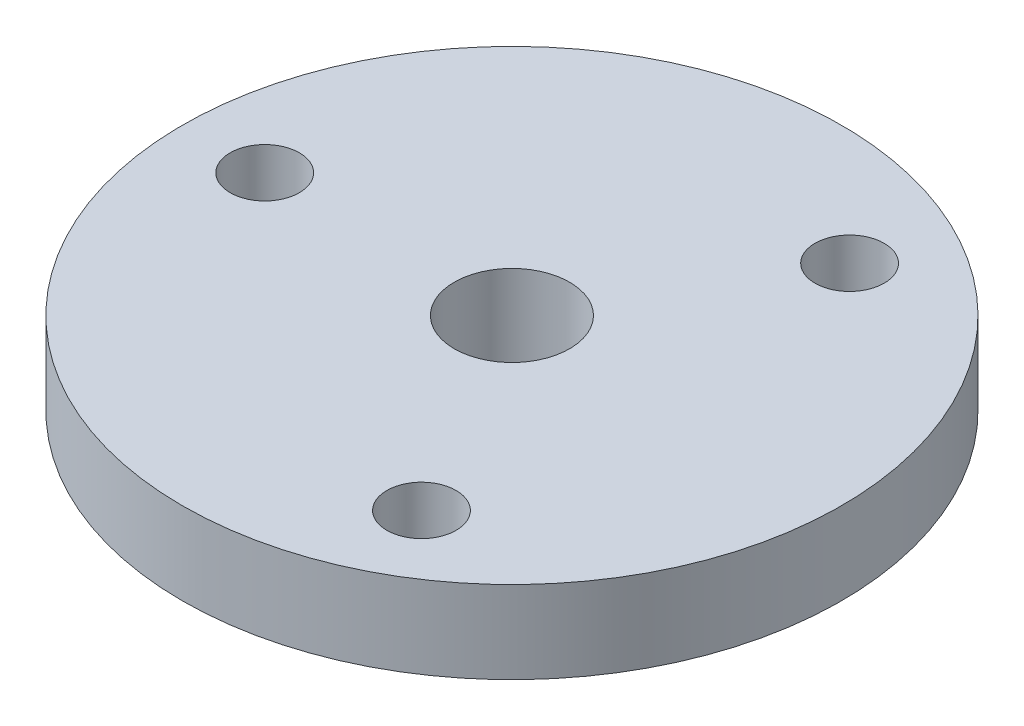
ISO-10303-21;
HEADER;
FILE_DESCRIPTION(('STEP AP214'),'2;1');
FILE_NAME('part.step','',(''),(''),'','','');
FILE_SCHEMA(('AUTOMOTIVE_DESIGN { 1 0 10303 214 1 1 1 1 }'));
ENDSEC;
DATA;
#1=APPLICATION_CONTEXT('core data for automotive mechanical design processes');
#2=APPLICATION_PROTOCOL_DEFINITION('international standard','automotive_design',2000,#1);
#3=PRODUCT_CONTEXT('',#1,'mechanical');
#4=PRODUCT('Part','Part','',(#3));
#5=PRODUCT_RELATED_PRODUCT_CATEGORY('part','',(#4));
#6=PRODUCT_DEFINITION_FORMATION('','',#4);
#7=PRODUCT_DEFINITION_CONTEXT('part definition',#1,'design');
#8=PRODUCT_DEFINITION('design','',#6,#7);
#9=PRODUCT_DEFINITION_SHAPE('','',#8);
#10=(LENGTH_UNIT() NAMED_UNIT(*) SI_UNIT(.MILLI.,.METRE.));
#11=(NAMED_UNIT(*) PLANE_ANGLE_UNIT() SI_UNIT($,.RADIAN.));
#12=(NAMED_UNIT(*) SI_UNIT($,.STERADIAN.) SOLID_ANGLE_UNIT());
#13=UNCERTAINTY_MEASURE_WITH_UNIT(LENGTH_MEASURE(1.E-05),#10,'distance_accuracy_value','');
#14=(GEOMETRIC_REPRESENTATION_CONTEXT(3) GLOBAL_UNCERTAINTY_ASSIGNED_CONTEXT((#13)) GLOBAL_UNIT_ASSIGNED_CONTEXT((#10,
#11,#12)) REPRESENTATION_CONTEXT('',''));
#15=CARTESIAN_POINT('',(0.,0.,0.));
#16=DIRECTION('',(0.,0.,1.));
#17=DIRECTION('',(1.,0.,0.));
#18=AXIS2_PLACEMENT_3D('',#15,#16,#17);
#19=CARTESIAN_POINT('',(0.,0.,0.));
#20=DIRECTION('',(0.,-1.,0.));
#21=DIRECTION('',(0.,0.,-1.));
#22=AXIS2_PLACEMENT_3D('',#19,#20,#21);
#23=CYLINDRICAL_SURFACE('',#22,6.5);
#24=CARTESIAN_POINT('',(0.,3.,0.));
#25=DIRECTION('',(0.,-1.,0.));
#26=DIRECTION('',(0.,0.,-1.));
#27=AXIS2_PLACEMENT_3D('',#24,#25,#26);
#28=CIRCLE('',#27,6.5);
#29=CARTESIAN_POINT('',(0.,3.,-6.5));
#30=VERTEX_POINT('',#29);
#31=EDGE_CURVE('E52',#30,#30,#28,.F.);
#32=ORIENTED_EDGE('',*,*,#31,.F.);
#33=EDGE_LOOP('',(#32));
#34=FACE_BOUND('',#33,.T.);
#35=CARTESIAN_POINT('',(0.,0.,0.));
#36=DIRECTION('',(0.,-1.,0.));
#37=DIRECTION('',(0.,0.,-1.));
#38=AXIS2_PLACEMENT_3D('',#35,#36,#37);
#39=CIRCLE('',#38,6.5);
#40=CARTESIAN_POINT('',(0.,0.,-6.5));
#41=VERTEX_POINT('',#40);
#42=EDGE_CURVE('E18',#41,#41,#39,.F.);
#43=ORIENTED_EDGE('',*,*,#42,.T.);
#44=EDGE_LOOP('',(#43));
#45=FACE_BOUND('',#44,.T.);
#46=ADVANCED_FACE('F15',(#34,#45),#23,.T.);
#47=CARTESIAN_POINT('',(0.,0.,0.));
#48=DIRECTION('',(0.,1.,0.));
#49=DIRECTION('',(0.,0.,1.));
#50=AXIS2_PLACEMENT_3D('',#47,#48,#49);
#51=PLANE('',#50);
#52=CARTESIAN_POINT('',(0.,0.,0.));
#53=DIRECTION('',(0.,1.,0.));
#54=DIRECTION('',(0.,0.,1.));
#55=AXIS2_PLACEMENT_3D('',#52,#53,#54);
#56=CIRCLE('',#55,3.5);
#57=CARTESIAN_POINT('',(0.,0.,3.5));
#58=VERTEX_POINT('',#57);
#59=EDGE_CURVE('E47',#58,#58,#56,.T.);
#60=ORIENTED_EDGE('',*,*,#59,.T.);
#61=EDGE_LOOP('',(#60));
#62=FACE_BOUND('',#61,.T.);
#63=ORIENTED_EDGE('',*,*,#42,.F.);
#64=EDGE_LOOP('',(#63));
#65=FACE_BOUND('',#64,.T.);
#66=ADVANCED_FACE('F60',(#62,#65),#51,.F.);
#67=CARTESIAN_POINT('',(0.,3.,0.));
#68=DIRECTION('',(0.,-1.,0.));
#69=DIRECTION('',(0.,0.,-1.));
#70=AXIS2_PLACEMENT_3D('',#67,#68,#69);
#71=PLANE('',#70);
#72=CARTESIAN_POINT('',(7.5,3.,-12.99038105677));
#73=DIRECTION('',(0.,-1.,0.));
#74=DIRECTION('',(0.,0.,-1.));
#75=AXIS2_PLACEMENT_3D('',#72,#73,#74);
#76=CIRCLE('',#75,2.1);
#77=CARTESIAN_POINT('',(7.5,3.,-15.09038105677));
#78=VERTEX_POINT('',#77);
#79=EDGE_CURVE('E38',#78,#78,#76,.F.);
#80=ORIENTED_EDGE('',*,*,#79,.T.);
#81=EDGE_LOOP('',(#80));
#82=FACE_BOUND('',#81,.T.);
#83=CARTESIAN_POINT('',(7.5,3.,12.99038105677));
#84=DIRECTION('',(0.,-1.,0.));
#85=DIRECTION('',(0.,0.,-1.));
#86=AXIS2_PLACEMENT_3D('',#83,#84,#85);
#87=CIRCLE('',#86,2.1);
#88=CARTESIAN_POINT('',(7.5,3.,10.89038105677));
#89=VERTEX_POINT('',#88);
#90=EDGE_CURVE('E41',#89,#89,#87,.F.);
#91=ORIENTED_EDGE('',*,*,#90,.T.);
#92=EDGE_LOOP('',(#91));
#93=FACE_BOUND('',#92,.T.);
#94=CARTESIAN_POINT('',(-15.,3.,0.));
#95=DIRECTION('',(0.,-1.,0.));
#96=DIRECTION('',(0.,0.,-1.));
#97=AXIS2_PLACEMENT_3D('',#94,#95,#96);
#98=CIRCLE('',#97,2.1);
#99=CARTESIAN_POINT('',(-15.,3.,-2.1));
#100=VERTEX_POINT('',#99);
#101=EDGE_CURVE('E44',#100,#100,#98,.F.);
#102=ORIENTED_EDGE('',*,*,#101,.T.);
#103=EDGE_LOOP('',(#102));
#104=FACE_BOUND('',#103,.T.);
#105=ORIENTED_EDGE('',*,*,#31,.T.);
#106=EDGE_LOOP('',(#105));
#107=FACE_BOUND('',#106,.T.);
#108=CARTESIAN_POINT('',(0.,3.,0.));
#109=DIRECTION('',(0.,1.,0.));
#110=DIRECTION('',(0.,0.,1.));
#111=AXIS2_PLACEMENT_3D('',#108,#109,#110);
#112=CIRCLE('',#111,20.);
#113=CARTESIAN_POINT('',(0.,3.,20.));
#114=VERTEX_POINT('',#113);
#115=EDGE_CURVE('E50',#114,#114,#112,.T.);
#116=ORIENTED_EDGE('',*,*,#115,.F.);
#117=EDGE_LOOP('',(#116));
#118=FACE_BOUND('',#117,.T.);
#119=ADVANCED_FACE('F62',(#82,#93,#104,#107,#118),#71,.T.);
#120=CARTESIAN_POINT('',(0.,0.,0.));
#121=DIRECTION('',(0.,1.,0.));
#122=DIRECTION('',(0.,0.,1.));
#123=AXIS2_PLACEMENT_3D('',#120,#121,#122);
#124=CYLINDRICAL_SURFACE('',#123,20.);
#125=CARTESIAN_POINT('',(0.,8.,0.));
#126=DIRECTION('',(0.,1.,0.));
#127=DIRECTION('',(0.,0.,1.));
#128=AXIS2_PLACEMENT_3D('',#125,#126,#127);
#129=CIRCLE('',#128,20.);
#130=CARTESIAN_POINT('',(0.,8.,20.));
#131=VERTEX_POINT('',#130);
#132=EDGE_CURVE('E35',#131,#131,#129,.T.);
#133=ORIENTED_EDGE('',*,*,#132,.F.);
#134=EDGE_LOOP('',(#133));
#135=FACE_BOUND('',#134,.T.);
#136=ORIENTED_EDGE('',*,*,#115,.T.);
#137=EDGE_LOOP('',(#136));
#138=FACE_BOUND('',#137,.T.);
#139=ADVANCED_FACE('F69',(#135,#138),#124,.T.);
#140=CARTESIAN_POINT('',(0.,0.,0.));
#141=DIRECTION('',(0.,1.,0.));
#142=DIRECTION('',(0.,0.,1.));
#143=AXIS2_PLACEMENT_3D('',#140,#141,#142);
#144=CYLINDRICAL_SURFACE('',#143,3.5);
#145=CARTESIAN_POINT('',(0.,8.,0.));
#146=DIRECTION('',(0.,1.,0.));
#147=DIRECTION('',(0.,0.,1.));
#148=AXIS2_PLACEMENT_3D('',#145,#146,#147);
#149=CIRCLE('',#148,3.5);
#150=CARTESIAN_POINT('',(0.,8.,3.5));
#151=VERTEX_POINT('',#150);
#152=EDGE_CURVE('E32',#151,#151,#149,.F.);
#153=ORIENTED_EDGE('',*,*,#152,.F.);
#154=EDGE_LOOP('',(#153));
#155=FACE_BOUND('',#154,.T.);
#156=ORIENTED_EDGE('',*,*,#59,.F.);
#157=EDGE_LOOP('',(#156));
#158=FACE_BOUND('',#157,.T.);
#159=ADVANCED_FACE('F91',(#155,#158),#144,.F.);
#160=CARTESIAN_POINT('',(-15.,8.,0.));
#161=DIRECTION('',(0.,-1.,0.));
#162=DIRECTION('',(0.,0.,-1.));
#163=AXIS2_PLACEMENT_3D('',#160,#161,#162);
#164=CYLINDRICAL_SURFACE('',#163,2.1);
#165=ORIENTED_EDGE('',*,*,#101,.F.);
#166=EDGE_LOOP('',(#165));
#167=FACE_BOUND('',#166,.T.);
#168=CARTESIAN_POINT('',(-15.,8.,0.));
#169=DIRECTION('',(0.,-1.,0.));
#170=DIRECTION('',(0.,0.,-1.));
#171=AXIS2_PLACEMENT_3D('',#168,#169,#170);
#172=CIRCLE('',#171,2.1);
#173=CARTESIAN_POINT('',(-15.,8.,-2.1));
#174=VERTEX_POINT('',#173);
#175=EDGE_CURVE('E27',#174,#174,#172,.T.);
#176=ORIENTED_EDGE('',*,*,#175,.F.);
#177=EDGE_LOOP('',(#176));
#178=FACE_BOUND('',#177,.T.);
#179=ADVANCED_FACE('F87',(#167,#178),#164,.F.);
#180=CARTESIAN_POINT('',(7.5,8.,12.99038105677));
#181=DIRECTION('',(0.,-1.,0.));
#182=DIRECTION('',(0.,0.,-1.));
#183=AXIS2_PLACEMENT_3D('',#180,#181,#182);
#184=CYLINDRICAL_SURFACE('',#183,2.1);
#185=ORIENTED_EDGE('',*,*,#90,.F.);
#186=EDGE_LOOP('',(#185));
#187=FACE_BOUND('',#186,.T.);
#188=CARTESIAN_POINT('',(7.5,8.,12.99038105677));
#189=DIRECTION('',(0.,-1.,0.));
#190=DIRECTION('',(0.,0.,-1.));
#191=AXIS2_PLACEMENT_3D('',#188,#189,#190);
#192=CIRCLE('',#191,2.1);
#193=CARTESIAN_POINT('',(7.5,8.,10.89038105677));
#194=VERTEX_POINT('',#193);
#195=EDGE_CURVE('E22',#194,#194,#192,.T.);
#196=ORIENTED_EDGE('',*,*,#195,.F.);
#197=EDGE_LOOP('',(#196));
#198=FACE_BOUND('',#197,.T.);
#199=ADVANCED_FACE('F80',(#187,#198),#184,.F.);
#200=CARTESIAN_POINT('',(7.5,8.,-12.99038105677));
#201=DIRECTION('',(0.,-1.,0.));
#202=DIRECTION('',(0.,0.,-1.));
#203=AXIS2_PLACEMENT_3D('',#200,#201,#202);
#204=CYLINDRICAL_SURFACE('',#203,2.1);
#205=ORIENTED_EDGE('',*,*,#79,.F.);
#206=EDGE_LOOP('',(#205));
#207=FACE_BOUND('',#206,.T.);
#208=CARTESIAN_POINT('',(7.5,8.,-12.99038105677));
#209=DIRECTION('',(0.,-1.,0.));
#210=DIRECTION('',(0.,0.,-1.));
#211=AXIS2_PLACEMENT_3D('',#208,#209,#210);
#212=CIRCLE('',#211,2.1);
#213=CARTESIAN_POINT('',(7.5,8.,-15.09038105677));
#214=VERTEX_POINT('',#213);
#215=EDGE_CURVE('E10',#214,#214,#212,.T.);
#216=ORIENTED_EDGE('',*,*,#215,.F.);
#217=EDGE_LOOP('',(#216));
#218=FACE_BOUND('',#217,.T.);
#219=ADVANCED_FACE('F75',(#207,#218),#204,.F.);
#220=CARTESIAN_POINT('',(0.,8.,0.));
#221=DIRECTION('',(0.,1.,0.));
#222=DIRECTION('',(0.,0.,1.));
#223=AXIS2_PLACEMENT_3D('',#220,#221,#222);
#224=PLANE('',#223);
#225=ORIENTED_EDGE('',*,*,#215,.T.);
#226=EDGE_LOOP('',(#225));
#227=FACE_BOUND('',#226,.T.);
#228=ORIENTED_EDGE('',*,*,#195,.T.);
#229=EDGE_LOOP('',(#228));
#230=FACE_BOUND('',#229,.T.);
#231=ORIENTED_EDGE('',*,*,#175,.T.);
#232=EDGE_LOOP('',(#231));
#233=FACE_BOUND('',#232,.T.);
#234=ORIENTED_EDGE('',*,*,#152,.T.);
#235=EDGE_LOOP('',(#234));
#236=FACE_BOUND('',#235,.T.);
#237=ORIENTED_EDGE('',*,*,#132,.T.);
#238=EDGE_LOOP('',(#237));
#239=FACE_BOUND('',#238,.T.);
#240=ADVANCED_FACE('F73',(#227,#230,#233,#236,#239),#224,.T.);
#241=CLOSED_SHELL('',(#46,#66,#119,#139,#159,#179,#199,#219,#240));
#242=MANIFOLD_SOLID_BREP('B1',#241);
#243=ADVANCED_BREP_SHAPE_REPRESENTATION('',(#18,#242),#14);
#244=SHAPE_DEFINITION_REPRESENTATION(#9,#243);
ENDSEC;
END-ISO-10303-21;
